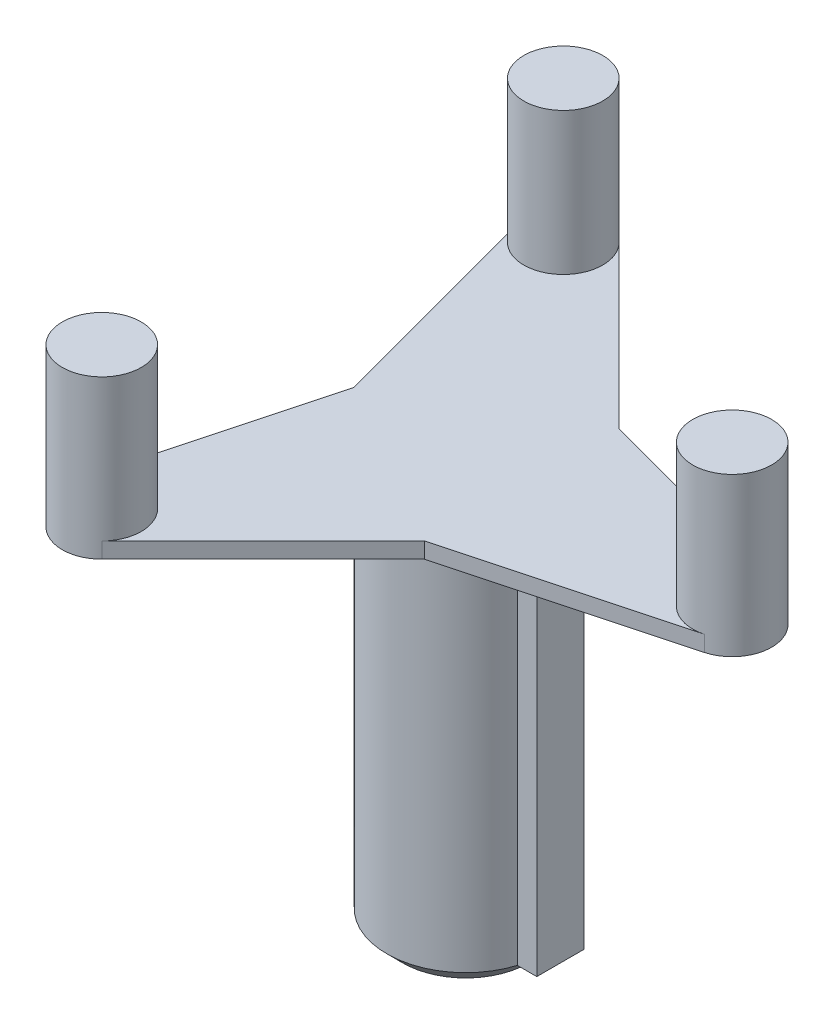
ISO-10303-21;
HEADER;
FILE_DESCRIPTION(('STEP AP214'),'2;1');
FILE_NAME('part.step','',(''),(''),'','','');
FILE_SCHEMA(('AUTOMOTIVE_DESIGN { 1 0 10303 214 1 1 1 1 }'));
ENDSEC;
DATA;
#1=APPLICATION_CONTEXT('core data for automotive mechanical design processes');
#2=APPLICATION_PROTOCOL_DEFINITION('international standard','automotive_design',2000,#1);
#3=PRODUCT_CONTEXT('',#1,'mechanical');
#4=PRODUCT('Part','Part','',(#3));
#5=PRODUCT_RELATED_PRODUCT_CATEGORY('part','',(#4));
#6=PRODUCT_DEFINITION_FORMATION('','',#4);
#7=PRODUCT_DEFINITION_CONTEXT('part definition',#1,'design');
#8=PRODUCT_DEFINITION('design','',#6,#7);
#9=PRODUCT_DEFINITION_SHAPE('','',#8);
#10=(LENGTH_UNIT() NAMED_UNIT(*) SI_UNIT(.MILLI.,.METRE.));
#11=(NAMED_UNIT(*) PLANE_ANGLE_UNIT() SI_UNIT($,.RADIAN.));
#12=(NAMED_UNIT(*) SI_UNIT($,.STERADIAN.) SOLID_ANGLE_UNIT());
#13=UNCERTAINTY_MEASURE_WITH_UNIT(LENGTH_MEASURE(1.E-05),#10,'distance_accuracy_value','');
#14=(GEOMETRIC_REPRESENTATION_CONTEXT(3) GLOBAL_UNCERTAINTY_ASSIGNED_CONTEXT((#13)) GLOBAL_UNIT_ASSIGNED_CONTEXT((#10,
#11,#12)) REPRESENTATION_CONTEXT('',''));
#15=CARTESIAN_POINT('',(0.,0.,0.));
#16=DIRECTION('',(0.,0.,1.));
#17=DIRECTION('',(1.,0.,0.));
#18=AXIS2_PLACEMENT_3D('',#15,#16,#17);
#19=CARTESIAN_POINT('',(334.901314291552,130.005353270483,-8.57302451988134E-13));
#20=DIRECTION('',(0.,-1.,0.));
#21=DIRECTION('',(0.,0.,-1.));
#22=AXIS2_PLACEMENT_3D('',#19,#20,#21);
#23=PLANE('',#22);
#24=CARTESIAN_POINT('',(334.901314291552,130.005353270483,-8.57302451988134E-13));
#25=DIRECTION('',(0.,-1.,0.));
#26=DIRECTION('',(0.,0.,-1.));
#27=AXIS2_PLACEMENT_3D('',#24,#25,#26);
#28=CIRCLE('',#27,50.0000000000023);
#29=CARTESIAN_POINT('',(347.842266546679,130.005353270483,-48.2962913144543));
#30=VERTEX_POINT('',#29);
#31=CARTESIAN_POINT('',(347.842266546678,130.005353270483,48.2962913144575));
#32=VERTEX_POINT('',#31);
#33=EDGE_CURVE('E191',#30,#32,#28,.T.);
#34=ORIENTED_EDGE('',*,*,#33,.T.);
#35=DIRECTION('',(-0.965925826289071,0.,0.258819045102511));
#36=VECTOR('',#35,1.);
#37=CARTESIAN_POINT('',(347.842266546678,130.005353270483,48.2962913144575));
#38=LINE('',#37,#36);
#39=CARTESIAN_POINT('',(68.4996450245561,130.005353270483,123.1459211629));
#40=VERTEX_POINT('',#39);
#41=EDGE_CURVE('E194',#32,#40,#38,.T.);
#42=ORIENTED_EDGE('',*,*,#41,.T.);
#43=DIRECTION('',(-0.707106781186554,0.,0.707106781186541));
#44=VECTOR('',#43,1.);
#45=CARTESIAN_POINT('',(68.4996450245561,130.005353270483,123.1459211629));
#46=LINE('',#45,#44);
#47=CARTESIAN_POINT('',(-135.993346649122,130.005353270483,327.638912836574));
#48=VERTEX_POINT('',#47);
#49=EDGE_CURVE('E197',#40,#48,#46,.T.);
#50=ORIENTED_EDGE('',*,*,#49,.T.);
#51=CARTESIAN_POINT('',(-171.348685708449,130.005353270483,292.283573777246));
#52=DIRECTION('',(0.,-1.,0.));
#53=DIRECTION('',(0.,0.,-1.));
#54=AXIS2_PLACEMENT_3D('',#51,#52,#53);
#55=CIRCLE('',#54,50.0000000000023);
#56=CARTESIAN_POINT('',(-219.644977022904,130.005353270483,279.342621522118));
#57=VERTEX_POINT('',#56);
#58=EDGE_CURVE('E199',#48,#57,#55,.T.);
#59=ORIENTED_EDGE('',*,*,#58,.T.);
#60=DIRECTION('',(0.258819045102535,0.,-0.965925826289064));
#61=VECTOR('',#60,1.);
#62=CARTESIAN_POINT('',(-219.644977022906,130.005353270483,279.342621522117));
#63=LINE('',#62,#61);
#64=CARTESIAN_POINT('',(-144.795347174457,130.005353270483,-2.79151912770227E-12));
#65=VERTEX_POINT('',#64);
#66=EDGE_CURVE('E201',#57,#65,#63,.T.);
#67=ORIENTED_EDGE('',*,*,#66,.T.);
#68=DIRECTION('',(-0.258819045102508,0.,-0.965925826289072));
#69=VECTOR('',#68,1.);
#70=CARTESIAN_POINT('',(-144.795347174457,130.005353270483,-2.79151912770227E-12));
#71=LINE('',#70,#69);
#72=CARTESIAN_POINT('',(-219.644977022899,130.005353270483,-279.342621522125));
#73=VERTEX_POINT('',#72);
#74=EDGE_CURVE('E203',#65,#73,#71,.T.);
#75=ORIENTED_EDGE('',*,*,#74,.T.);
#76=CARTESIAN_POINT('',(-171.348685708445,130.005353270483,-292.283573777251));
#77=DIRECTION('',(0.,-1.,0.));
#78=DIRECTION('',(0.,0.,-1.));
#79=AXIS2_PLACEMENT_3D('',#76,#77,#78);
#80=CIRCLE('',#79,50.0000000000001);
#81=CARTESIAN_POINT('',(-135.993346649117,130.005353270483,-327.638912836578));
#82=VERTEX_POINT('',#81);
#83=EDGE_CURVE('E205',#73,#82,#80,.T.);
#84=ORIENTED_EDGE('',*,*,#83,.T.);
#85=DIRECTION('',(0.707106781186544,0.,0.707106781186551));
#86=VECTOR('',#85,1.);
#87=CARTESIAN_POINT('',(-135.993346649117,130.005353270483,-327.638912836578));
#88=LINE('',#87,#86);
#89=CARTESIAN_POINT('',(68.4996450245577,130.005353270483,-123.145921162901));
#90=VERTEX_POINT('',#89);
#91=EDGE_CURVE('E207',#82,#90,#88,.T.);
#92=ORIENTED_EDGE('',*,*,#91,.T.);
#93=DIRECTION('',(0.965925826289067,0.,0.258819045102525));
#94=VECTOR('',#93,1.);
#95=CARTESIAN_POINT('',(68.4996450245577,130.005353270483,-123.145921162901));
#96=LINE('',#95,#94);
#97=EDGE_CURVE('E209',#90,#30,#96,.T.);
#98=ORIENTED_EDGE('',*,*,#97,.T.);
#99=EDGE_LOOP('',(#34,#42,#50,#59,#67,#75,#84,#92,#98));
#100=FACE_BOUND('',#99,.T.);
#101=DIRECTION('',(-1.,0.,0.));
#102=VECTOR('',#101,1.);
#103=CARTESIAN_POINT('',(92.7952344332469,130.005353270483,29.9999999999991));
#104=LINE('',#103,#102);
#105=CARTESIAN_POINT('',(117.401314291552,130.005353270483,29.9999999999991));
#106=VERTEX_POINT('',#105);
#107=CARTESIAN_POINT('',(92.7952344332469,130.005353270483,29.9999999999991));
#108=VERTEX_POINT('',#107);
#109=EDGE_CURVE('E156',#106,#108,#104,.T.);
#110=ORIENTED_EDGE('',*,*,#109,.F.);
#111=DIRECTION('',(0.,0.,1.));
#112=VECTOR('',#111,1.);
#113=CARTESIAN_POINT('',(117.401314291552,130.005353270483,-30.0000000000009));
#114=LINE('',#113,#112);
#115=CARTESIAN_POINT('',(117.401314291552,130.005353270483,-30.0000000000009));
#116=VERTEX_POINT('',#115);
#117=EDGE_CURVE('E164',#116,#106,#114,.T.);
#118=ORIENTED_EDGE('',*,*,#117,.F.);
#119=DIRECTION('',(1.,0.,0.));
#120=VECTOR('',#119,1.);
#121=CARTESIAN_POINT('',(92.7952344332469,130.005353270483,-30.0000000000009));
#122=LINE('',#121,#120);
#123=CARTESIAN_POINT('',(92.795234433247,130.005353270483,-30.0000000000009));
#124=VERTEX_POINT('',#123);
#125=EDGE_CURVE('E174',#124,#116,#122,.T.);
#126=ORIENTED_EDGE('',*,*,#125,.F.);
#127=CARTESIAN_POINT('',(-2.59868570844762,130.005353270483,-8.57302451988134E-13));
#128=DIRECTION('',(0.,-1.,0.));
#129=DIRECTION('',(0.,0.,-1.));
#130=AXIS2_PLACEMENT_3D('',#127,#128,#129);
#131=CIRCLE('',#130,100.);
#132=EDGE_CURVE('E172',#108,#124,#131,.T.);
#133=ORIENTED_EDGE('',*,*,#132,.F.);
#134=EDGE_LOOP('',(#110,#118,#126,#133));
#135=FACE_BOUND('',#134,.T.);
#136=ADVANCED_FACE('F43',(#100,#135),#23,.T.);
#137=CARTESIAN_POINT('',(334.901314291552,150.005353270483,-8.57302451988134E-13));
#138=DIRECTION('',(0.,-1.,0.));
#139=DIRECTION('',(0.,0.,-1.));
#140=AXIS2_PLACEMENT_3D('',#137,#138,#139);
#141=PLANE('',#140);
#142=CARTESIAN_POINT('',(-171.348685708445,150.005353270483,-292.283573777251));
#143=DIRECTION('',(0.,-1.,0.));
#144=DIRECTION('',(0.,0.,-1.));
#145=AXIS2_PLACEMENT_3D('',#142,#143,#144);
#146=CIRCLE('',#145,50.0000000000001);
#147=CARTESIAN_POINT('',(-219.644977022899,150.005353270483,-279.342621522125));
#148=VERTEX_POINT('',#147);
#149=CARTESIAN_POINT('',(-135.993346649117,150.005353270483,-327.638912836578));
#150=VERTEX_POINT('',#149);
#151=EDGE_CURVE('E254',#148,#150,#146,.F.);
#152=ORIENTED_EDGE('',*,*,#151,.F.);
#153=DIRECTION('',(-0.258819045102508,0.,-0.965925826289072));
#154=VECTOR('',#153,1.);
#155=CARTESIAN_POINT('',(-144.795347174457,150.005353270483,-2.79151912770227E-12));
#156=LINE('',#155,#154);
#157=CARTESIAN_POINT('',(-144.795347174457,150.005353270483,-2.79151912770227E-12));
#158=VERTEX_POINT('',#157);
#159=EDGE_CURVE('E218',#158,#148,#156,.T.);
#160=ORIENTED_EDGE('',*,*,#159,.F.);
#161=DIRECTION('',(0.258819045102535,0.,-0.965925826289064));
#162=VECTOR('',#161,1.);
#163=CARTESIAN_POINT('',(-219.644977022906,150.005353270483,279.342621522117));
#164=LINE('',#163,#162);
#165=CARTESIAN_POINT('',(-219.644977022902,150.005353270483,279.342621522118));
#166=VERTEX_POINT('',#165);
#167=EDGE_CURVE('E216',#166,#158,#164,.T.);
#168=ORIENTED_EDGE('',*,*,#167,.F.);
#169=CARTESIAN_POINT('',(-171.348685708449,150.005353270483,292.283573777246));
#170=DIRECTION('',(0.,1.,0.));
#171=DIRECTION('',(0.,0.,1.));
#172=AXIS2_PLACEMENT_3D('',#169,#170,#171);
#173=CIRCLE('',#172,50.0000000000001);
#174=CARTESIAN_POINT('',(-135.993346649122,150.005353270483,327.638912836574));
#175=VERTEX_POINT('',#174);
#176=EDGE_CURVE('E184',#175,#166,#173,.T.);
#177=ORIENTED_EDGE('',*,*,#176,.F.);
#178=DIRECTION('',(-0.707106781186554,0.,0.707106781186541));
#179=VECTOR('',#178,1.);
#180=CARTESIAN_POINT('',(68.4996450245561,150.005353270483,123.1459211629));
#181=LINE('',#180,#179);
#182=CARTESIAN_POINT('',(68.4996450245561,150.005353270483,123.1459211629));
#183=VERTEX_POINT('',#182);
#184=EDGE_CURVE('E213',#183,#175,#181,.T.);
#185=ORIENTED_EDGE('',*,*,#184,.F.);
#186=DIRECTION('',(-0.965925826289071,0.,0.258819045102511));
#187=VECTOR('',#186,1.);
#188=CARTESIAN_POINT('',(347.842266546678,150.005353270483,48.2962913144575));
#189=LINE('',#188,#187);
#190=CARTESIAN_POINT('',(347.842266546679,150.005353270483,48.2962913144572));
#191=VERTEX_POINT('',#190);
#192=EDGE_CURVE('E188',#191,#183,#189,.T.);
#193=ORIENTED_EDGE('',*,*,#192,.F.);
#194=CARTESIAN_POINT('',(334.901314291552,150.005353270483,-8.57302451988134E-13));
#195=DIRECTION('',(0.,1.,0.));
#196=DIRECTION('',(0.,0.,1.));
#197=AXIS2_PLACEMENT_3D('',#194,#195,#196);
#198=CIRCLE('',#197,50.);
#199=CARTESIAN_POINT('',(347.842266546679,150.005353270483,-48.2962913144543));
#200=VERTEX_POINT('',#199);
#201=EDGE_CURVE('E250',#200,#191,#198,.T.);
#202=ORIENTED_EDGE('',*,*,#201,.F.);
#203=DIRECTION('',(0.965925826289067,0.,0.258819045102525));
#204=VECTOR('',#203,1.);
#205=CARTESIAN_POINT('',(68.4996450245577,150.005353270483,-123.145921162901));
#206=LINE('',#205,#204);
#207=CARTESIAN_POINT('',(68.4996450245577,150.005353270483,-123.145921162901));
#208=VERTEX_POINT('',#207);
#209=EDGE_CURVE('E195',#208,#200,#206,.T.);
#210=ORIENTED_EDGE('',*,*,#209,.F.);
#211=DIRECTION('',(0.707106781186544,0.,0.707106781186551));
#212=VECTOR('',#211,1.);
#213=CARTESIAN_POINT('',(-135.993346649117,150.005353270483,-327.638912836578));
#214=LINE('',#213,#212);
#215=EDGE_CURVE('E221',#150,#208,#214,.T.);
#216=ORIENTED_EDGE('',*,*,#215,.F.);
#217=EDGE_LOOP('',(#152,#160,#168,#177,#185,#193,#202,#210,#216));
#218=FACE_BOUND('',#217,.T.);
#219=ADVANCED_FACE('F322',(#218),#141,.F.);
#220=CARTESIAN_POINT('',(334.901314291552,330.005353270483,-8.57302451988134E-13));
#221=DIRECTION('',(0.,-1.,0.));
#222=DIRECTION('',(0.,0.,-1.));
#223=AXIS2_PLACEMENT_3D('',#220,#221,#222);
#224=CYLINDRICAL_SURFACE('',#223,50.);
#225=CARTESIAN_POINT('',(334.901314291552,330.005353270483,-8.57302451988134E-13));
#226=DIRECTION('',(0.,1.,0.));
#227=DIRECTION('',(0.,0.,1.));
#228=AXIS2_PLACEMENT_3D('',#225,#226,#227);
#229=CIRCLE('',#228,50.);
#230=CARTESIAN_POINT('',(334.901314291552,330.005353270483,49.9999999999992));
#231=VERTEX_POINT('',#230);
#232=EDGE_CURVE('E251',#231,#231,#229,.T.);
#233=ORIENTED_EDGE('',*,*,#232,.F.);
#234=EDGE_LOOP('',(#233));
#235=FACE_BOUND('',#234,.T.);
#236=ORIENTED_EDGE('',*,*,#201,.T.);
#237=DIRECTION('',(0.,1.,0.));
#238=VECTOR('',#237,1.);
#239=CARTESIAN_POINT('',(347.842266546678,130.005353270483,48.2962913144575));
#240=LINE('',#239,#238);
#241=EDGE_CURVE('E248',#32,#191,#240,.T.);
#242=ORIENTED_EDGE('',*,*,#241,.F.);
#243=ORIENTED_EDGE('',*,*,#33,.F.);
#244=DIRECTION('',(0.,1.,0.));
#245=VECTOR('',#244,1.);
#246=CARTESIAN_POINT('',(347.842266546679,130.005353270483,-48.2962913144543));
#247=LINE('',#246,#245);
#248=EDGE_CURVE('E211',#30,#200,#247,.T.);
#249=ORIENTED_EDGE('',*,*,#248,.T.);
#250=EDGE_LOOP('',(#236,#242,#243,#249));
#251=FACE_BOUND('',#250,.T.);
#252=ADVANCED_FACE('F328',(#235,#251),#224,.T.);
#253=CARTESIAN_POINT('',(334.901314291552,330.005353270483,-8.57302451988134E-13));
#254=DIRECTION('',(0.,1.,0.));
#255=DIRECTION('',(0.,0.,1.));
#256=AXIS2_PLACEMENT_3D('',#253,#254,#255);
#257=PLANE('',#256);
#258=ORIENTED_EDGE('',*,*,#232,.T.);
#259=EDGE_LOOP('',(#258));
#260=FACE_BOUND('',#259,.T.);
#261=ADVANCED_FACE('F366',(#260),#257,.T.);
#262=CARTESIAN_POINT('',(347.842266546678,130.005353270483,48.2962913144575));
#263=DIRECTION('',(-0.258819045102511,0.,-0.965925826289071));
#264=DIRECTION('',(-0.965925826289071,0.,0.258819045102511));
#265=AXIS2_PLACEMENT_3D('',#262,#263,#264);
#266=PLANE('',#265);
#267=ORIENTED_EDGE('',*,*,#192,.T.);
#268=DIRECTION('',(0.,1.,0.));
#269=VECTOR('',#268,1.);
#270=CARTESIAN_POINT('',(68.4996450245561,130.005353270483,123.1459211629));
#271=LINE('',#270,#269);
#272=EDGE_CURVE('E245',#40,#183,#271,.T.);
#273=ORIENTED_EDGE('',*,*,#272,.F.);
#274=ORIENTED_EDGE('',*,*,#41,.F.);
#275=ORIENTED_EDGE('',*,*,#241,.T.);
#276=EDGE_LOOP('',(#267,#273,#274,#275));
#277=FACE_BOUND('',#276,.T.);
#278=ADVANCED_FACE('F362',(#277),#266,.F.);
#279=CARTESIAN_POINT('',(68.4996450245561,130.005353270483,123.1459211629));
#280=DIRECTION('',(-0.707106781186541,0.,-0.707106781186554));
#281=DIRECTION('',(-0.707106781186554,0.,0.707106781186541));
#282=AXIS2_PLACEMENT_3D('',#279,#280,#281);
#283=PLANE('',#282);
#284=ORIENTED_EDGE('',*,*,#184,.T.);
#285=DIRECTION('',(0.,1.,0.));
#286=VECTOR('',#285,1.);
#287=CARTESIAN_POINT('',(-135.993346649122,130.005353270483,327.638912836574));
#288=LINE('',#287,#286);
#289=EDGE_CURVE('E242',#48,#175,#288,.T.);
#290=ORIENTED_EDGE('',*,*,#289,.F.);
#291=ORIENTED_EDGE('',*,*,#49,.F.);
#292=ORIENTED_EDGE('',*,*,#272,.T.);
#293=EDGE_LOOP('',(#284,#290,#291,#292));
#294=FACE_BOUND('',#293,.T.);
#295=ADVANCED_FACE('F358',(#294),#283,.F.);
#296=CARTESIAN_POINT('',(-171.348685708449,130.005353270483,292.283573777246));
#297=DIRECTION('',(0.,1.,0.));
#298=DIRECTION('',(0.,0.,1.));
#299=AXIS2_PLACEMENT_3D('',#296,#297,#298);
#300=CYLINDRICAL_SURFACE('',#299,50.0000000000023);
#301=ORIENTED_EDGE('',*,*,#289,.T.);
#302=ORIENTED_EDGE('',*,*,#176,.T.);
#303=DIRECTION('',(0.,1.,0.));
#304=VECTOR('',#303,1.);
#305=CARTESIAN_POINT('',(-219.644977022904,130.005353270483,279.342621522118));
#306=LINE('',#305,#304);
#307=EDGE_CURVE('E239',#57,#166,#306,.T.);
#308=ORIENTED_EDGE('',*,*,#307,.F.);
#309=ORIENTED_EDGE('',*,*,#58,.F.);
#310=EDGE_LOOP('',(#301,#302,#308,#309));
#311=FACE_BOUND('',#310,.T.);
#312=CARTESIAN_POINT('',(-171.348685708449,330.005353270483,292.283573777246));
#313=DIRECTION('',(0.,1.,0.));
#314=DIRECTION('',(0.,0.,1.));
#315=AXIS2_PLACEMENT_3D('',#312,#313,#314);
#316=CIRCLE('',#315,50.0000000000001);
#317=CARTESIAN_POINT('',(-171.348685708449,330.005353270483,342.283573777246));
#318=VERTEX_POINT('',#317);
#319=EDGE_CURVE('E185',#318,#318,#316,.T.);
#320=ORIENTED_EDGE('',*,*,#319,.F.);
#321=EDGE_LOOP('',(#320));
#322=FACE_BOUND('',#321,.T.);
#323=ADVANCED_FACE('F354',(#311,#322),#300,.T.);
#324=CARTESIAN_POINT('',(-219.644977022906,130.005353270483,279.342621522117));
#325=DIRECTION('',(0.965925826289064,0.,0.258819045102535));
#326=DIRECTION('',(0.258819045102535,0.,-0.965925826289065));
#327=AXIS2_PLACEMENT_3D('',#324,#325,#326);
#328=PLANE('',#327);
#329=ORIENTED_EDGE('',*,*,#167,.T.);
#330=DIRECTION('',(0.,1.,0.));
#331=VECTOR('',#330,1.);
#332=CARTESIAN_POINT('',(-144.795347174457,130.005353270483,-2.79151912770227E-12));
#333=LINE('',#332,#331);
#334=EDGE_CURVE('E236',#65,#158,#333,.T.);
#335=ORIENTED_EDGE('',*,*,#334,.F.);
#336=ORIENTED_EDGE('',*,*,#66,.F.);
#337=ORIENTED_EDGE('',*,*,#307,.T.);
#338=EDGE_LOOP('',(#329,#335,#336,#337));
#339=FACE_BOUND('',#338,.T.);
#340=ADVANCED_FACE('F350',(#339),#328,.F.);
#341=CARTESIAN_POINT('',(-144.795347174457,130.005353270483,-2.79151912770227E-12));
#342=DIRECTION('',(0.965925826289072,0.,-0.258819045102508));
#343=DIRECTION('',(-0.258819045102508,0.,-0.965925826289072));
#344=AXIS2_PLACEMENT_3D('',#341,#342,#343);
#345=PLANE('',#344);
#346=ORIENTED_EDGE('',*,*,#159,.T.);
#347=DIRECTION('',(0.,1.,0.));
#348=VECTOR('',#347,1.);
#349=CARTESIAN_POINT('',(-219.644977022899,130.005353270483,-279.342621522125));
#350=LINE('',#349,#348);
#351=EDGE_CURVE('E233',#73,#148,#350,.T.);
#352=ORIENTED_EDGE('',*,*,#351,.F.);
#353=ORIENTED_EDGE('',*,*,#74,.F.);
#354=ORIENTED_EDGE('',*,*,#334,.T.);
#355=EDGE_LOOP('',(#346,#352,#353,#354));
#356=FACE_BOUND('',#355,.T.);
#357=ADVANCED_FACE('F346',(#356),#345,.F.);
#358=CARTESIAN_POINT('',(-171.348685708445,130.005353270483,-292.283573777251));
#359=DIRECTION('',(0.,1.,0.));
#360=DIRECTION('',(0.,0.,1.));
#361=AXIS2_PLACEMENT_3D('',#358,#359,#360);
#362=CYLINDRICAL_SURFACE('',#361,50.0000000000001);
#363=ORIENTED_EDGE('',*,*,#351,.T.);
#364=ORIENTED_EDGE('',*,*,#151,.T.);
#365=DIRECTION('',(0.,1.,0.));
#366=VECTOR('',#365,1.);
#367=CARTESIAN_POINT('',(-135.993346649117,130.005353270483,-327.638912836578));
#368=LINE('',#367,#366);
#369=EDGE_CURVE('E230',#82,#150,#368,.T.);
#370=ORIENTED_EDGE('',*,*,#369,.F.);
#371=ORIENTED_EDGE('',*,*,#83,.F.);
#372=EDGE_LOOP('',(#363,#364,#370,#371));
#373=FACE_BOUND('',#372,.T.);
#374=CARTESIAN_POINT('',(-171.348685708445,330.005353270483,-292.283573777251));
#375=DIRECTION('',(0.,1.,0.));
#376=DIRECTION('',(0.,0.,1.));
#377=AXIS2_PLACEMENT_3D('',#374,#375,#376);
#378=CIRCLE('',#377,50.0000000000001);
#379=CARTESIAN_POINT('',(-171.348685708445,330.005353270483,-242.283573777251));
#380=VERTEX_POINT('',#379);
#381=EDGE_CURVE('E160',#380,#380,#378,.T.);
#382=ORIENTED_EDGE('',*,*,#381,.F.);
#383=EDGE_LOOP('',(#382));
#384=FACE_BOUND('',#383,.T.);
#385=ADVANCED_FACE('F342',(#373,#384),#362,.T.);
#386=CARTESIAN_POINT('',(-135.993346649117,130.005353270483,-327.638912836578));
#387=DIRECTION('',(-0.707106781186551,0.,0.707106781186544));
#388=DIRECTION('',(0.707106781186544,0.,0.707106781186551));
#389=AXIS2_PLACEMENT_3D('',#386,#387,#388);
#390=PLANE('',#389);
#391=ORIENTED_EDGE('',*,*,#215,.T.);
#392=DIRECTION('',(0.,1.,0.));
#393=VECTOR('',#392,1.);
#394=CARTESIAN_POINT('',(68.4996450245577,130.005353270483,-123.145921162901));
#395=LINE('',#394,#393);
#396=EDGE_CURVE('E227',#90,#208,#395,.T.);
#397=ORIENTED_EDGE('',*,*,#396,.F.);
#398=ORIENTED_EDGE('',*,*,#91,.F.);
#399=ORIENTED_EDGE('',*,*,#369,.T.);
#400=EDGE_LOOP('',(#391,#397,#398,#399));
#401=FACE_BOUND('',#400,.T.);
#402=ADVANCED_FACE('F338',(#401),#390,.F.);
#403=CARTESIAN_POINT('',(68.4996450245577,130.005353270483,-123.145921162901));
#404=DIRECTION('',(-0.258819045102525,0.,0.965925826289067));
#405=DIRECTION('',(0.965925826289067,0.,0.258819045102525));
#406=AXIS2_PLACEMENT_3D('',#403,#404,#405);
#407=PLANE('',#406);
#408=ORIENTED_EDGE('',*,*,#209,.T.);
#409=ORIENTED_EDGE('',*,*,#248,.F.);
#410=ORIENTED_EDGE('',*,*,#97,.F.);
#411=ORIENTED_EDGE('',*,*,#396,.T.);
#412=EDGE_LOOP('',(#408,#409,#410,#411));
#413=FACE_BOUND('',#412,.T.);
#414=ADVANCED_FACE('F335',(#413),#407,.F.);
#415=CARTESIAN_POINT('',(-171.348685708449,330.005353270483,292.283573777246));
#416=DIRECTION('',(0.,1.,0.));
#417=DIRECTION('',(0.,0.,1.));
#418=AXIS2_PLACEMENT_3D('',#415,#416,#417);
#419=PLANE('',#418);
#420=ORIENTED_EDGE('',*,*,#319,.T.);
#421=EDGE_LOOP('',(#420));
#422=FACE_BOUND('',#421,.T.);
#423=ADVANCED_FACE('F332',(#422),#419,.T.);
#424=CARTESIAN_POINT('',(-171.348685708445,330.005353270483,-292.283573777251));
#425=DIRECTION('',(0.,1.,0.));
#426=DIRECTION('',(0.,0.,1.));
#427=AXIS2_PLACEMENT_3D('',#424,#425,#426);
#428=PLANE('',#427);
#429=ORIENTED_EDGE('',*,*,#381,.T.);
#430=EDGE_LOOP('',(#429));
#431=FACE_BOUND('',#430,.T.);
#432=ADVANCED_FACE('F403',(#431),#428,.T.);
#433=CARTESIAN_POINT('',(117.401314291552,-369.994646729517,-30.0000000000009));
#434=DIRECTION('',(-1.,0.,0.));
#435=DIRECTION('',(0.,0.,1.));
#436=AXIS2_PLACEMENT_3D('',#433,#434,#435);
#437=PLANE('',#436);
#438=DIRECTION('',(0.,1.,0.));
#439=VECTOR('',#438,1.);
#440=CARTESIAN_POINT('',(117.401314291552,-369.994646729517,29.9999999999991));
#441=LINE('',#440,#439);
#442=CARTESIAN_POINT('',(117.401314291552,-349.994646729517,29.9999999999991));
#443=VERTEX_POINT('',#442);
#444=EDGE_CURVE('E151',#443,#106,#441,.T.);
#445=ORIENTED_EDGE('',*,*,#444,.F.);
#446=DIRECTION('',(0.,0.,-1.));
#447=VECTOR('',#446,1.);
#448=CARTESIAN_POINT('',(117.401314291552,-349.994646729517,-30.0000000000009));
#449=LINE('',#448,#447);
#450=CARTESIAN_POINT('',(117.401314291552,-349.994646729517,-30.0000000000009));
#451=VERTEX_POINT('',#450);
#452=EDGE_CURVE('E67',#443,#451,#449,.T.);
#453=ORIENTED_EDGE('',*,*,#452,.T.);
#454=DIRECTION('',(0.,1.,0.));
#455=VECTOR('',#454,1.);
#456=CARTESIAN_POINT('',(117.401314291552,-369.994646729517,-30.0000000000009));
#457=LINE('',#456,#455);
#458=EDGE_CURVE('E166',#451,#116,#457,.T.);
#459=ORIENTED_EDGE('',*,*,#458,.T.);
#460=ORIENTED_EDGE('',*,*,#117,.T.);
#461=EDGE_LOOP('',(#445,#453,#459,#460));
#462=FACE_BOUND('',#461,.T.);
#463=ADVANCED_FACE('F165',(#462),#437,.F.);
#464=CARTESIAN_POINT('',(92.7952344332469,-369.994646729517,29.9999999999991));
#465=DIRECTION('',(0.,0.,-1.));
#466=DIRECTION('',(-1.,0.,0.));
#467=AXIS2_PLACEMENT_3D('',#464,#465,#466);
#468=PLANE('',#467);
#469=DIRECTION('',(0.,1.,0.));
#470=VECTOR('',#469,1.);
#471=CARTESIAN_POINT('',(92.7952344332469,-369.994646729517,29.9999999999991));
#472=LINE('',#471,#470);
#473=CARTESIAN_POINT('',(92.7952344332469,-349.994646729517,29.9999999999991));
#474=VERTEX_POINT('',#473);
#475=EDGE_CURVE('E161',#474,#108,#472,.T.);
#476=ORIENTED_EDGE('',*,*,#475,.F.);
#477=DIRECTION('',(1.,0.,0.));
#478=VECTOR('',#477,1.);
#479=CARTESIAN_POINT('',(117.401314291552,-349.994646729517,29.9999999999991));
#480=LINE('',#479,#478);
#481=EDGE_CURVE('E159',#474,#443,#480,.T.);
#482=ORIENTED_EDGE('',*,*,#481,.T.);
#483=ORIENTED_EDGE('',*,*,#444,.T.);
#484=ORIENTED_EDGE('',*,*,#109,.T.);
#485=EDGE_LOOP('',(#476,#482,#483,#484));
#486=FACE_BOUND('',#485,.T.);
#487=ADVANCED_FACE('F154',(#486),#468,.F.);
#488=CARTESIAN_POINT('',(-2.59868570844762,-369.994646729517,-8.57302451988134E-13));
#489=DIRECTION('',(0.,1.,0.));
#490=DIRECTION('',(0.,0.,1.));
#491=AXIS2_PLACEMENT_3D('',#488,#489,#490);
#492=CYLINDRICAL_SURFACE('',#491,100.);
#493=DIRECTION('',(0.,1.,0.));
#494=VECTOR('',#493,1.);
#495=CARTESIAN_POINT('',(92.7952344332469,-369.994646729517,-30.0000000000009));
#496=LINE('',#495,#494);
#497=CARTESIAN_POINT('',(92.7952344332469,-349.994646729517,-30.0000000000009));
#498=VERTEX_POINT('',#497);
#499=EDGE_CURVE('E179',#498,#124,#496,.T.);
#500=ORIENTED_EDGE('',*,*,#499,.F.);
#501=CARTESIAN_POINT('',(-2.59868570844762,-349.994646729517,-8.57302451988134E-13));
#502=DIRECTION('',(0.,-1.,0.));
#503=DIRECTION('',(0.,0.,-1.));
#504=AXIS2_PLACEMENT_3D('',#501,#502,#503);
#505=CIRCLE('',#504,100.);
#506=EDGE_CURVE('E12',#498,#474,#505,.F.);
#507=ORIENTED_EDGE('',*,*,#506,.T.);
#508=ORIENTED_EDGE('',*,*,#475,.T.);
#509=ORIENTED_EDGE('',*,*,#132,.T.);
#510=EDGE_LOOP('',(#500,#507,#508,#509));
#511=FACE_BOUND('',#510,.T.);
#512=ADVANCED_FACE('F309',(#511),#492,.T.);
#513=CARTESIAN_POINT('',(92.7952344332469,-369.994646729517,-30.0000000000009));
#514=DIRECTION('',(0.,0.,1.));
#515=DIRECTION('',(1.,0.,0.));
#516=AXIS2_PLACEMENT_3D('',#513,#514,#515);
#517=PLANE('',#516);
#518=ORIENTED_EDGE('',*,*,#458,.F.);
#519=DIRECTION('',(-1.,0.,0.));
#520=VECTOR('',#519,1.);
#521=CARTESIAN_POINT('',(92.7952344332469,-349.994646729517,-30.0000000000009));
#522=LINE('',#521,#520);
#523=EDGE_CURVE('E52',#451,#498,#522,.T.);
#524=ORIENTED_EDGE('',*,*,#523,.T.);
#525=ORIENTED_EDGE('',*,*,#499,.T.);
#526=ORIENTED_EDGE('',*,*,#125,.T.);
#527=EDGE_LOOP('',(#518,#524,#525,#526));
#528=FACE_BOUND('',#527,.T.);
#529=ADVANCED_FACE('F310',(#528),#517,.F.);
#530=CARTESIAN_POINT('',(-2.59868570844762,-369.994646729517,-8.57302451988134E-13));
#531=DIRECTION('',(0.,-1.,0.));
#532=DIRECTION('',(0.,0.,-1.));
#533=AXIS2_PLACEMENT_3D('',#530,#531,#532);
#534=PLANE('',#533);
#535=DIRECTION('',(0.,0.,1.));
#536=VECTOR('',#535,1.);
#537=CARTESIAN_POINT('',(97.4013142915526,-369.994646729517,29.9999999999991));
#538=LINE('',#537,#536);
#539=CARTESIAN_POINT('',(97.4013142915526,-369.994646729517,-10.0000000000011));
#540=VERTEX_POINT('',#539);
#541=CARTESIAN_POINT('',(97.4013142915526,-369.994646729517,9.99999999999935));
#542=VERTEX_POINT('',#541);
#543=EDGE_CURVE('E262',#540,#542,#538,.T.);
#544=ORIENTED_EDGE('',*,*,#543,.T.);
#545=DIRECTION('',(-1.,0.,0.));
#546=VECTOR('',#545,1.);
#547=CARTESIAN_POINT('',(92.7952344332469,-369.994646729517,9.99999999999935));
#548=LINE('',#547,#546);
#549=CARTESIAN_POINT('',(76.7738536234903,-369.994646729517,9.99999999999935));
#550=VERTEX_POINT('',#549);
#551=EDGE_CURVE('E264',#542,#550,#548,.T.);
#552=ORIENTED_EDGE('',*,*,#551,.T.);
#553=CARTESIAN_POINT('',(-2.59868570844762,-369.994646729517,-8.57302451988134E-13));
#554=DIRECTION('',(0.,-1.,0.));
#555=DIRECTION('',(0.,0.,-1.));
#556=AXIS2_PLACEMENT_3D('',#553,#554,#555);
#557=CIRCLE('',#556,80.0000000000002);
#558=CARTESIAN_POINT('',(76.7738536234903,-369.994646729517,-10.0000000000011));
#559=VERTEX_POINT('',#558);
#560=EDGE_CURVE('E258',#550,#559,#557,.T.);
#561=ORIENTED_EDGE('',*,*,#560,.T.);
#562=DIRECTION('',(1.,0.,0.));
#563=VECTOR('',#562,1.);
#564=CARTESIAN_POINT('',(117.401314291552,-369.994646729517,-10.0000000000011));
#565=LINE('',#564,#563);
#566=EDGE_CURVE('E260',#559,#540,#565,.T.);
#567=ORIENTED_EDGE('',*,*,#566,.T.);
#568=EDGE_LOOP('',(#544,#552,#561,#567));
#569=FACE_BOUND('',#568,.T.);
#570=ADVANCED_FACE('F312',(#569),#534,.T.);
#571=CARTESIAN_POINT('',(-2.59868570844762,-369.994646729517,-10.0000000000011));
#572=DIRECTION('',(0.,-0.707106781186546,-0.707106781186549));
#573=DIRECTION('',(-1.,0.,0.));
#574=AXIS2_PLACEMENT_3D('',#571,#572,#573);
#575=PLANE('',#574);
#576=CARTESIAN_POINT('',(92.7952344332469,-349.994646729517,-30.0000000000009));
#577=CARTESIAN_POINT('',(92.1711734366736,-350.845091486573,-29.149555242945));
#578=CARTESIAN_POINT('',(91.5423001731216,-351.693764481995,-28.3008822475232));
#579=CARTESIAN_POINT('',(90.2744748127525,-353.387346995785,-26.6072997337328));
#580=CARTESIAN_POINT('',(89.6355226260612,-354.232256480508,-25.7623902490099));
#581=CARTESIAN_POINT('',(87.7033971372719,-356.760314359889,-23.2343323696286));
#582=CARTESIAN_POINT('',(86.3944576061147,-358.437471213518,-21.5571755159996));
#583=CARTESIAN_POINT('',(84.3965036627872,-360.939504875848,-19.0551418536698));
#584=CARTESIAN_POINT('',(83.7247198144419,-361.771282486958,-18.2233642425598));
#585=CARTESIAN_POINT('',(82.3690889214667,-363.429909550147,-16.5647371793714));
#586=CARTESIAN_POINT('',(81.685241925877,-364.256759022241,-15.737887707277));
#587=CARTESIAN_POINT('',(80.3046329563271,-365.905479705066,-14.089167024452));
#588=CARTESIAN_POINT('',(79.6078661326627,-366.727348886211,-13.2672978433067));
#589=CARTESIAN_POINT('',(78.201010921456,-368.365383713502,-11.6292630160162));
#590=CARTESIAN_POINT('',(77.4909223135295,-369.181549264984,-10.8130974645341));
#591=CARTESIAN_POINT('',(76.7738536234903,-369.994646729517,-10.0000000000011));
#592=B_SPLINE_CURVE_WITH_KNOTS('',3,(#576,#577,#578,#579,#580,#581,#582,#583,#584,#585,#586,
#587,#588,#589,#590,#591),.UNSPECIFIED.,.F.,.F.,(4,2,2,2,2,2,2,4),(0.,4.06490437813255,
8.12984502366918,16.2564824399369,20.320293740323,24.3840885239681,28.4494409152638,
32.5148606197058),.UNSPECIFIED.);
#593=EDGE_CURVE('E289',#498,#559,#592,.T.);
#594=ORIENTED_EDGE('',*,*,#593,.F.);
#595=ORIENTED_EDGE('',*,*,#523,.F.);
#596=DIRECTION('',(-0.577350269189625,-0.577350269189628,0.577350269189625));
#597=VECTOR('',#596,1.);
#598=CARTESIAN_POINT('',(64.0679809582193,-403.327980062851,23.3333333333322));
#599=LINE('',#598,#597);
#600=EDGE_CURVE('E47',#540,#451,#599,.F.);
#601=ORIENTED_EDGE('',*,*,#600,.F.);
#602=ORIENTED_EDGE('',*,*,#566,.F.);
#603=EDGE_LOOP('',(#594,#595,#601,#602));
#604=FACE_BOUND('',#603,.T.);
#605=ADVANCED_FACE('F286',(#604),#575,.T.);
#606=CARTESIAN_POINT('',(97.4013142915526,-369.994646729517,-8.57302451988134E-13));
#607=DIRECTION('',(0.707106781186549,-0.707106781186546,0.));
#608=DIRECTION('',(0.,0.,-1.));
#609=AXIS2_PLACEMENT_3D('',#606,#607,#608);
#610=PLANE('',#609);
#611=ORIENTED_EDGE('',*,*,#600,.T.);
#612=ORIENTED_EDGE('',*,*,#452,.F.);
#613=DIRECTION('',(-0.577350269189625,-0.577350269189628,-0.577350269189625));
#614=VECTOR('',#613,1.);
#615=CARTESIAN_POINT('',(94.0679809582192,-373.32798006285,6.66666666666596));
#616=LINE('',#615,#614);
#617=EDGE_CURVE('E278',#542,#443,#616,.F.);
#618=ORIENTED_EDGE('',*,*,#617,.F.);
#619=ORIENTED_EDGE('',*,*,#543,.F.);
#620=EDGE_LOOP('',(#611,#612,#618,#619));
#621=FACE_BOUND('',#620,.T.);
#622=ADVANCED_FACE('F45',(#621),#610,.T.);
#623=CARTESIAN_POINT('',(-2.59868570844762,-369.994646729517,-8.57302451988134E-13));
#624=DIRECTION('',(0.,1.,0.));
#625=DIRECTION('',(0.,0.,1.));
#626=AXIS2_PLACEMENT_3D('',#623,#624,#625);
#627=CONICAL_SURFACE('',#626,80.0000000000002,0.785398163397446);
#628=ORIENTED_EDGE('',*,*,#593,.T.);
#629=ORIENTED_EDGE('',*,*,#560,.F.);
#630=CARTESIAN_POINT('',(76.7738536234903,-369.994646729517,9.99999999999935));
#631=CARTESIAN_POINT('',(77.4909223135295,-369.181549264984,10.8130974645324));
#632=CARTESIAN_POINT('',(78.201010921456,-368.365383713502,11.6292630160145));
#633=CARTESIAN_POINT('',(79.6078661326627,-366.727348886211,13.267297843305));
#634=CARTESIAN_POINT('',(80.3046329563271,-365.905479705066,14.0891670244503));
#635=CARTESIAN_POINT('',(81.685241925877,-364.256759022241,15.7378877072753));
#636=CARTESIAN_POINT('',(82.3690889214667,-363.429909550147,16.5647371793697));
#637=CARTESIAN_POINT('',(83.7247198144419,-361.771282486958,18.223364242558));
#638=CARTESIAN_POINT('',(84.3965036627872,-360.939504875848,19.0551418536681));
#639=CARTESIAN_POINT('',(86.3944576061147,-358.437471213518,21.5571755159979));
#640=CARTESIAN_POINT('',(87.7033971372719,-356.760314359889,23.2343323696269));
#641=CARTESIAN_POINT('',(89.6355226260612,-354.232256480508,25.7623902490082));
#642=CARTESIAN_POINT('',(90.2744748127525,-353.387346995785,26.6072997337311));
#643=CARTESIAN_POINT('',(91.5423001731217,-351.693764481995,28.3008822475214));
#644=CARTESIAN_POINT('',(92.1711734366736,-350.845091486573,29.1495552429433));
#645=CARTESIAN_POINT('',(92.7952344332469,-349.994646729517,29.9999999999991));
#646=B_SPLINE_CURVE_WITH_KNOTS('',3,(#630,#631,#632,#633,#634,#635,#636,#637,#638,#639,#640,
#641,#642,#643,#644,#645),.UNSPECIFIED.,.F.,.F.,(4,2,2,2,2,2,2,4),(0.,4.06541970444197,
8.13077209573761,12.1945668793827,16.2583781797689,24.3850155960366,28.4499562415732,
32.5148606197058),.UNSPECIFIED.);
#647=EDGE_CURVE('E270',#474,#550,#646,.F.);
#648=ORIENTED_EDGE('',*,*,#647,.F.);
#649=ORIENTED_EDGE('',*,*,#506,.F.);
#650=EDGE_LOOP('',(#628,#629,#648,#649));
#651=FACE_BOUND('',#650,.T.);
#652=ADVANCED_FACE('F282',(#651),#627,.T.);
#653=CARTESIAN_POINT('',(-2.59868570844762,-369.994646729517,9.99999999999935));
#654=DIRECTION('',(0.,-0.707106781186546,0.707106781186549));
#655=DIRECTION('',(1.,0.,0.));
#656=AXIS2_PLACEMENT_3D('',#653,#654,#655);
#657=PLANE('',#656);
#658=ORIENTED_EDGE('',*,*,#617,.T.);
#659=ORIENTED_EDGE('',*,*,#481,.F.);
#660=ORIENTED_EDGE('',*,*,#647,.T.);
#661=ORIENTED_EDGE('',*,*,#551,.F.);
#662=EDGE_LOOP('',(#658,#659,#660,#661));
#663=FACE_BOUND('',#662,.T.);
#664=ADVANCED_FACE('F279',(#663),#657,.T.);
#665=CLOSED_SHELL('',(#136,#219,#252,#261,#278,#295,#323,#340,#357,#385,#402,#414,#423,#432,
#463,#487,#512,#529,#570,#605,#622,#652,#664));
#666=MANIFOLD_SOLID_BREP('B2',#665);
#667=ADVANCED_BREP_SHAPE_REPRESENTATION('',(#18,#666),#14);
#668=SHAPE_DEFINITION_REPRESENTATION(#9,#667);
ENDSEC;
END-ISO-10303-21;
